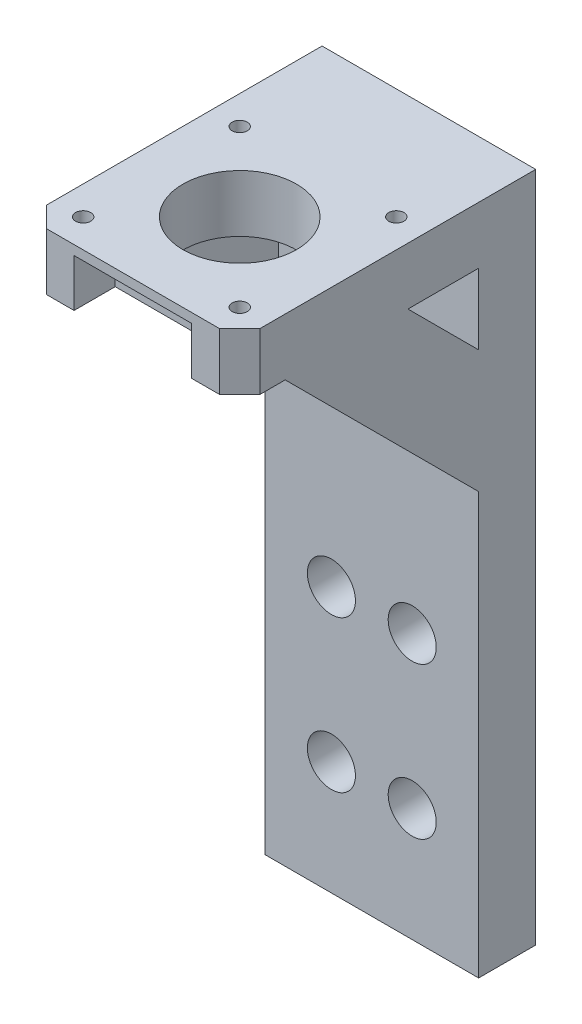
ISO-10303-21;
HEADER;
FILE_DESCRIPTION(('STEP AP214'),'2;1');
FILE_NAME('part.step','',(''),(''),'','','');
FILE_SCHEMA(('AUTOMOTIVE_DESIGN { 1 0 10303 214 1 1 1 1 }'));
ENDSEC;
DATA;
#1=APPLICATION_CONTEXT('core data for automotive mechanical design processes');
#2=APPLICATION_PROTOCOL_DEFINITION('international standard','automotive_design',2000,#1);
#3=PRODUCT_CONTEXT('',#1,'mechanical');
#4=PRODUCT('Part','Part','',(#3));
#5=PRODUCT_RELATED_PRODUCT_CATEGORY('part','',(#4));
#6=PRODUCT_DEFINITION_FORMATION('','',#4);
#7=PRODUCT_DEFINITION_CONTEXT('part definition',#1,'design');
#8=PRODUCT_DEFINITION('design','',#6,#7);
#9=PRODUCT_DEFINITION_SHAPE('','',#8);
#10=(LENGTH_UNIT() NAMED_UNIT(*) SI_UNIT(.MILLI.,.METRE.));
#11=(NAMED_UNIT(*) PLANE_ANGLE_UNIT() SI_UNIT($,.RADIAN.));
#12=(NAMED_UNIT(*) SI_UNIT($,.STERADIAN.) SOLID_ANGLE_UNIT());
#13=UNCERTAINTY_MEASURE_WITH_UNIT(LENGTH_MEASURE(1.E-05),#10,'distance_accuracy_value','');
#14=(GEOMETRIC_REPRESENTATION_CONTEXT(3) GLOBAL_UNCERTAINTY_ASSIGNED_CONTEXT((#13)) GLOBAL_UNIT_ASSIGNED_CONTEXT((#10,
#11,#12)) REPRESENTATION_CONTEXT('',''));
#15=CARTESIAN_POINT('',(0.,0.,0.));
#16=DIRECTION('',(0.,0.,1.));
#17=DIRECTION('',(1.,0.,0.));
#18=AXIS2_PLACEMENT_3D('',#15,#16,#17);
#19=CARTESIAN_POINT('',(-75.3143794388894,-38.2999999999999,-26.15));
#20=DIRECTION('',(0.,0.707106781186549,-0.707106781186546));
#21=DIRECTION('',(0.,0.707106781186546,0.707106781186549));
#22=AXIS2_PLACEMENT_3D('',#19,#20,#21);
#23=PLANE('',#22);
#24=DIRECTION('',(0.,-0.707106781186546,-0.707106781186549));
#25=VECTOR('',#24,1.);
#26=CARTESIAN_POINT('',(-21.15,-38.2999999999999,-26.15));
#27=LINE('',#26,#25);
#28=CARTESIAN_POINT('',(-21.15,0.,12.15));
#29=VERTEX_POINT('',#28);
#30=CARTESIAN_POINT('',(-21.15,-24.2114581737199,-12.06145817372));
#31=VERTEX_POINT('',#30);
#32=EDGE_CURVE('E335',#29,#31,#27,.T.);
#33=ORIENTED_EDGE('',*,*,#32,.T.);
#34=DIRECTION('',(-1.,0.,0.));
#35=VECTOR('',#34,1.);
#36=CARTESIAN_POINT('',(-3.23326728916457,-24.2114581737199,-12.06145817372));
#37=LINE('',#36,#35);
#38=CARTESIAN_POINT('',(-18.5,-24.2114581737199,-12.06145817372));
#39=VERTEX_POINT('',#38);
#40=EDGE_CURVE('E225',#39,#31,#37,.T.);
#41=ORIENTED_EDGE('',*,*,#40,.F.);
#42=DIRECTION('',(0.,0.707106781186546,0.707106781186549));
#43=VECTOR('',#42,1.);
#44=CARTESIAN_POINT('',(-18.5,-38.2999999999999,-26.15));
#45=LINE('',#44,#43);
#46=CARTESIAN_POINT('',(-18.5,0.,12.15));
#47=VERTEX_POINT('',#46);
#48=EDGE_CURVE('E217',#39,#47,#45,.T.);
#49=ORIENTED_EDGE('',*,*,#48,.T.);
#50=DIRECTION('',(1.,0.,0.));
#51=VECTOR('',#50,1.);
#52=CARTESIAN_POINT('',(-75.3143794388894,0.,12.15));
#53=LINE('',#52,#51);
#54=EDGE_CURVE('E360',#29,#47,#53,.T.);
#55=ORIENTED_EDGE('',*,*,#54,.F.);
#56=EDGE_LOOP('',(#33,#41,#49,#55));
#57=FACE_BOUND('',#56,.T.);
#58=ADVANCED_FACE('F38',(#57),#23,.F.);
#59=CARTESIAN_POINT('',(0.,0.,0.));
#60=DIRECTION('',(0.,1.,0.));
#61=DIRECTION('',(0.,0.,1.));
#62=AXIS2_PLACEMENT_3D('',#59,#60,#61);
#63=PLANE('',#62);
#64=CARTESIAN_POINT('',(-15.5,0.,15.5));
#65=DIRECTION('',(0.,1.,0.));
#66=DIRECTION('',(0.,0.,1.));
#67=AXIS2_PLACEMENT_3D('',#64,#65,#66);
#68=CIRCLE('',#67,1.5);
#69=CARTESIAN_POINT('',(-15.5,0.,17.));
#70=VERTEX_POINT('',#69);
#71=EDGE_CURVE('E410',#70,#70,#68,.T.);
#72=ORIENTED_EDGE('',*,*,#71,.T.);
#73=EDGE_LOOP('',(#72));
#74=FACE_BOUND('',#73,.T.);
#75=CARTESIAN_POINT('',(15.5,0.,15.5));
#76=DIRECTION('',(0.,1.,0.));
#77=DIRECTION('',(0.,0.,1.));
#78=AXIS2_PLACEMENT_3D('',#75,#76,#77);
#79=CIRCLE('',#78,1.5);
#80=CARTESIAN_POINT('',(15.5,0.,17.));
#81=VERTEX_POINT('',#80);
#82=EDGE_CURVE('E415',#81,#81,#79,.T.);
#83=ORIENTED_EDGE('',*,*,#82,.T.);
#84=EDGE_LOOP('',(#83));
#85=FACE_BOUND('',#84,.T.);
#86=CARTESIAN_POINT('',(15.5,0.,-15.5));
#87=DIRECTION('',(0.,1.,0.));
#88=DIRECTION('',(0.,0.,1.));
#89=AXIS2_PLACEMENT_3D('',#86,#87,#88);
#90=CIRCLE('',#89,1.5);
#91=CARTESIAN_POINT('',(15.5,0.,-14.));
#92=VERTEX_POINT('',#91);
#93=EDGE_CURVE('E423',#92,#92,#90,.T.);
#94=ORIENTED_EDGE('',*,*,#93,.T.);
#95=EDGE_LOOP('',(#94));
#96=FACE_BOUND('',#95,.T.);
#97=CARTESIAN_POINT('',(-15.5,0.,-15.5));
#98=DIRECTION('',(0.,1.,0.));
#99=DIRECTION('',(0.,0.,1.));
#100=AXIS2_PLACEMENT_3D('',#97,#98,#99);
#101=CIRCLE('',#100,1.5);
#102=CARTESIAN_POINT('',(-15.5,0.,-14.));
#103=VERTEX_POINT('',#102);
#104=EDGE_CURVE('E431',#103,#103,#101,.T.);
#105=ORIENTED_EDGE('',*,*,#104,.T.);
#106=EDGE_LOOP('',(#105));
#107=FACE_BOUND('',#106,.T.);
#108=CARTESIAN_POINT('',(0.,0.,0.));
#109=DIRECTION('',(0.,1.,0.));
#110=DIRECTION('',(0.,0.,1.));
#111=AXIS2_PLACEMENT_3D('',#108,#109,#110);
#112=CIRCLE('',#111,11.25);
#113=CARTESIAN_POINT('',(0.,0.,11.25));
#114=VERTEX_POINT('',#113);
#115=EDGE_CURVE('E439',#114,#114,#112,.T.);
#116=ORIENTED_EDGE('',*,*,#115,.T.);
#117=EDGE_LOOP('',(#116));
#118=FACE_BOUND('',#117,.T.);
#119=DIRECTION('',(1.,0.,0.));
#120=VECTOR('',#119,1.);
#121=CARTESIAN_POINT('',(-11.65,0.,13.));
#122=LINE('',#121,#120);
#123=CARTESIAN_POINT('',(-11.65,0.,13.));
#124=VERTEX_POINT('',#123);
#125=CARTESIAN_POINT('',(11.65,0.,13.));
#126=VERTEX_POINT('',#125);
#127=EDGE_CURVE('E247',#124,#126,#122,.T.);
#128=ORIENTED_EDGE('',*,*,#127,.F.);
#129=DIRECTION('',(0.,0.,-1.));
#130=VECTOR('',#129,1.);
#131=CARTESIAN_POINT('',(-11.65,0.,21.15));
#132=LINE('',#131,#130);
#133=CARTESIAN_POINT('',(-11.65,0.,21.15));
#134=VERTEX_POINT('',#133);
#135=EDGE_CURVE('E229',#134,#124,#132,.T.);
#136=ORIENTED_EDGE('',*,*,#135,.F.);
#137=DIRECTION('',(1.,0.,0.));
#138=VECTOR('',#137,1.);
#139=CARTESIAN_POINT('',(-17.15,0.,21.15));
#140=LINE('',#139,#138);
#141=CARTESIAN_POINT('',(-17.15,0.,21.15));
#142=VERTEX_POINT('',#141);
#143=EDGE_CURVE('E476',#142,#134,#140,.T.);
#144=ORIENTED_EDGE('',*,*,#143,.F.);
#145=DIRECTION('',(0.707106781186548,0.,0.707106781186548));
#146=VECTOR('',#145,1.);
#147=CARTESIAN_POINT('',(-17.15,0.,21.15));
#148=LINE('',#147,#146);
#149=CARTESIAN_POINT('',(-21.15,0.,17.15));
#150=VERTEX_POINT('',#149);
#151=EDGE_CURVE('E472',#150,#142,#148,.T.);
#152=ORIENTED_EDGE('',*,*,#151,.F.);
#153=DIRECTION('',(0.,0.,1.));
#154=VECTOR('',#153,1.);
#155=CARTESIAN_POINT('',(-21.15,0.,17.15));
#156=LINE('',#155,#154);
#157=EDGE_CURVE('E447',#29,#150,#156,.T.);
#158=ORIENTED_EDGE('',*,*,#157,.F.);
#159=ORIENTED_EDGE('',*,*,#54,.T.);
#160=DIRECTION('',(0.,0.,-1.));
#161=VECTOR('',#160,1.);
#162=CARTESIAN_POINT('',(-18.5,0.,12.15));
#163=LINE('',#162,#161);
#164=CARTESIAN_POINT('',(-18.5,0.,-12.15));
#165=VERTEX_POINT('',#164);
#166=EDGE_CURVE('E346',#47,#165,#163,.T.);
#167=ORIENTED_EDGE('',*,*,#166,.T.);
#168=DIRECTION('',(1.,0.,0.));
#169=VECTOR('',#168,1.);
#170=CARTESIAN_POINT('',(-75.3143794388894,0.,-12.15));
#171=LINE('',#170,#169);
#172=CARTESIAN_POINT('',(-21.15,0.,-12.15));
#173=VERTEX_POINT('',#172);
#174=EDGE_CURVE('E357',#173,#165,#171,.T.);
#175=ORIENTED_EDGE('',*,*,#174,.F.);
#176=CARTESIAN_POINT('',(-21.15,0.,-26.15));
#177=VERTEX_POINT('',#176);
#178=EDGE_CURVE('E468',#177,#173,#156,.T.);
#179=ORIENTED_EDGE('',*,*,#178,.F.);
#180=DIRECTION('',(-1.,0.,0.));
#181=VECTOR('',#180,1.);
#182=CARTESIAN_POINT('',(17.15,0.,-26.15));
#183=LINE('',#182,#181);
#184=CARTESIAN_POINT('',(21.15,0.,-26.15));
#185=VERTEX_POINT('',#184);
#186=EDGE_CURVE('E403',#185,#177,#183,.T.);
#187=ORIENTED_EDGE('',*,*,#186,.F.);
#188=DIRECTION('',(0.,0.,-1.));
#189=VECTOR('',#188,1.);
#190=CARTESIAN_POINT('',(21.15,0.,17.15));
#191=LINE('',#190,#189);
#192=CARTESIAN_POINT('',(21.15,0.,-12.15));
#193=VERTEX_POINT('',#192);
#194=EDGE_CURVE('E483',#193,#185,#191,.T.);
#195=ORIENTED_EDGE('',*,*,#194,.F.);
#196=DIRECTION('',(1.,0.,0.));
#197=VECTOR('',#196,1.);
#198=CARTESIAN_POINT('',(18.5,0.,-12.15));
#199=LINE('',#198,#197);
#200=CARTESIAN_POINT('',(18.5,0.,-12.15));
#201=VERTEX_POINT('',#200);
#202=EDGE_CURVE('E324',#201,#193,#199,.T.);
#203=ORIENTED_EDGE('',*,*,#202,.F.);
#204=DIRECTION('',(0.,0.,1.));
#205=VECTOR('',#204,1.);
#206=CARTESIAN_POINT('',(18.5,0.,12.15));
#207=LINE('',#206,#205);
#208=CARTESIAN_POINT('',(18.5,0.,12.15));
#209=VERTEX_POINT('',#208);
#210=EDGE_CURVE('E310',#201,#209,#207,.T.);
#211=ORIENTED_EDGE('',*,*,#210,.T.);
#212=DIRECTION('',(1.,0.,0.));
#213=VECTOR('',#212,1.);
#214=CARTESIAN_POINT('',(18.5,0.,12.15));
#215=LINE('',#214,#213);
#216=CARTESIAN_POINT('',(21.15,0.,12.15));
#217=VERTEX_POINT('',#216);
#218=EDGE_CURVE('E319',#209,#217,#215,.T.);
#219=ORIENTED_EDGE('',*,*,#218,.T.);
#220=CARTESIAN_POINT('',(21.15,0.,17.15));
#221=VERTEX_POINT('',#220);
#222=EDGE_CURVE('E455',#221,#217,#191,.T.);
#223=ORIENTED_EDGE('',*,*,#222,.F.);
#224=DIRECTION('',(0.707106781186548,0.,-0.707106781186548));
#225=VECTOR('',#224,1.);
#226=CARTESIAN_POINT('',(17.15,0.,21.15));
#227=LINE('',#226,#225);
#228=CARTESIAN_POINT('',(17.15,0.,21.15));
#229=VERTEX_POINT('',#228);
#230=EDGE_CURVE('E480',#229,#221,#227,.T.);
#231=ORIENTED_EDGE('',*,*,#230,.F.);
#232=CARTESIAN_POINT('',(11.65,0.,21.15));
#233=VERTEX_POINT('',#232);
#234=EDGE_CURVE('E475',#233,#229,#140,.T.);
#235=ORIENTED_EDGE('',*,*,#234,.F.);
#236=DIRECTION('',(0.,0.,1.));
#237=VECTOR('',#236,1.);
#238=CARTESIAN_POINT('',(11.65,0.,21.15));
#239=LINE('',#238,#237);
#240=EDGE_CURVE('E235',#126,#233,#239,.T.);
#241=ORIENTED_EDGE('',*,*,#240,.F.);
#242=EDGE_LOOP('',(#128,#136,#144,#152,#158,#159,#167,#175,#179,#187,#195,#203,#211,#219,#223,
#231,#235,#241));
#243=FACE_BOUND('',#242,.T.);
#244=ADVANCED_FACE('F508',(#74,#85,#96,#107,#118,#243),#63,.F.);
#245=CARTESIAN_POINT('',(0.,0.,-26.15));
#246=DIRECTION('',(0.,0.,-1.));
#247=DIRECTION('',(-1.,0.,0.));
#248=AXIS2_PLACEMENT_3D('',#245,#246,#247);
#249=PLANE('',#248);
#250=CARTESIAN_POINT('',(8.,-69.2,-26.15));
#251=DIRECTION('',(0.,0.,-1.));
#252=DIRECTION('',(-1.,0.,0.));
#253=AXIS2_PLACEMENT_3D('',#250,#251,#252);
#254=CIRCLE('',#253,4.76249999999999);
#255=CARTESIAN_POINT('',(3.2375,-69.2,-26.15));
#256=VERTEX_POINT('',#255);
#257=EDGE_CURVE('E293',#256,#256,#254,.T.);
#258=ORIENTED_EDGE('',*,*,#257,.T.);
#259=EDGE_LOOP('',(#258));
#260=FACE_BOUND('',#259,.T.);
#261=CARTESIAN_POINT('',(-8.,-99.2,-26.15));
#262=DIRECTION('',(0.,0.,-1.));
#263=DIRECTION('',(-1.,0.,0.));
#264=AXIS2_PLACEMENT_3D('',#261,#262,#263);
#265=CIRCLE('',#264,4.7625);
#266=CARTESIAN_POINT('',(-12.7625,-99.2,-26.15));
#267=VERTEX_POINT('',#266);
#268=EDGE_CURVE('E289',#267,#267,#265,.T.);
#269=ORIENTED_EDGE('',*,*,#268,.T.);
#270=EDGE_LOOP('',(#269));
#271=FACE_BOUND('',#270,.T.);
#272=CARTESIAN_POINT('',(8.,-99.2,-26.15));
#273=DIRECTION('',(0.,0.,-1.));
#274=DIRECTION('',(-1.,0.,0.));
#275=AXIS2_PLACEMENT_3D('',#272,#273,#274);
#276=CIRCLE('',#275,4.76249999999999);
#277=CARTESIAN_POINT('',(3.2375,-99.2,-26.15));
#278=VERTEX_POINT('',#277);
#279=EDGE_CURVE('E285',#278,#278,#276,.T.);
#280=ORIENTED_EDGE('',*,*,#279,.T.);
#281=EDGE_LOOP('',(#280));
#282=FACE_BOUND('',#281,.T.);
#283=CARTESIAN_POINT('',(-8.,-69.2,-26.15));
#284=DIRECTION('',(0.,0.,-1.));
#285=DIRECTION('',(-1.,0.,0.));
#286=AXIS2_PLACEMENT_3D('',#283,#284,#285);
#287=CIRCLE('',#286,4.7625);
#288=CARTESIAN_POINT('',(-12.7625,-69.2,-26.15));
#289=VERTEX_POINT('',#288);
#290=EDGE_CURVE('E281',#289,#289,#287,.T.);
#291=ORIENTED_EDGE('',*,*,#290,.T.);
#292=EDGE_LOOP('',(#291));
#293=FACE_BOUND('',#292,.T.);
#294=DIRECTION('',(0.,-1.,0.));
#295=VECTOR('',#294,1.);
#296=CARTESIAN_POINT('',(21.15,9.84885780179612,-26.15));
#297=LINE('',#296,#295);
#298=CARTESIAN_POINT('',(21.15,-38.2999999999999,-26.15));
#299=VERTEX_POINT('',#298);
#300=CARTESIAN_POINT('',(21.15,-121.7,-26.15));
#301=VERTEX_POINT('',#300);
#302=EDGE_CURVE('E339',#299,#301,#297,.T.);
#303=ORIENTED_EDGE('',*,*,#302,.F.);
#304=DIRECTION('',(1.,0.,0.));
#305=VECTOR('',#304,1.);
#306=CARTESIAN_POINT('',(18.5,-38.2999999999999,-26.15));
#307=LINE('',#306,#305);
#308=CARTESIAN_POINT('',(18.5,-38.2999999999999,-26.15));
#309=VERTEX_POINT('',#308);
#310=EDGE_CURVE('E314',#309,#299,#307,.T.);
#311=ORIENTED_EDGE('',*,*,#310,.F.);
#312=DIRECTION('',(0.,1.,0.));
#313=VECTOR('',#312,1.);
#314=CARTESIAN_POINT('',(18.5,-14.,-26.15));
#315=LINE('',#314,#313);
#316=CARTESIAN_POINT('',(18.5,-14.,-26.15));
#317=VERTEX_POINT('',#316);
#318=EDGE_CURVE('E302',#309,#317,#315,.T.);
#319=ORIENTED_EDGE('',*,*,#318,.T.);
#320=DIRECTION('',(1.,0.,0.));
#321=VECTOR('',#320,1.);
#322=CARTESIAN_POINT('',(18.5,-14.,-26.15));
#323=LINE('',#322,#321);
#324=CARTESIAN_POINT('',(21.15,-14.,-26.15));
#325=VERTEX_POINT('',#324);
#326=EDGE_CURVE('E328',#317,#325,#323,.T.);
#327=ORIENTED_EDGE('',*,*,#326,.T.);
#328=EDGE_CURVE('E376',#185,#325,#297,.T.);
#329=ORIENTED_EDGE('',*,*,#328,.F.);
#330=ORIENTED_EDGE('',*,*,#186,.T.);
#331=DIRECTION('',(0.,-1.,0.));
#332=VECTOR('',#331,1.);
#333=CARTESIAN_POINT('',(-21.15,9.84885780179612,-26.15));
#334=LINE('',#333,#332);
#335=CARTESIAN_POINT('',(-21.15,-14.,-26.15));
#336=VERTEX_POINT('',#335);
#337=EDGE_CURVE('E371',#177,#336,#334,.T.);
#338=ORIENTED_EDGE('',*,*,#337,.T.);
#339=DIRECTION('',(1.,0.,0.));
#340=VECTOR('',#339,1.);
#341=CARTESIAN_POINT('',(-75.3143794388894,-14.,-26.15));
#342=LINE('',#341,#340);
#343=CARTESIAN_POINT('',(-18.5,-14.,-26.15));
#344=VERTEX_POINT('',#343);
#345=EDGE_CURVE('E354',#336,#344,#342,.T.);
#346=ORIENTED_EDGE('',*,*,#345,.T.);
#347=DIRECTION('',(0.,-1.,0.));
#348=VECTOR('',#347,1.);
#349=CARTESIAN_POINT('',(-18.5,-14.,-26.15));
#350=LINE('',#349,#348);
#351=CARTESIAN_POINT('',(-18.5,-38.2999999999999,-26.15));
#352=VERTEX_POINT('',#351);
#353=EDGE_CURVE('E323',#344,#352,#350,.T.);
#354=ORIENTED_EDGE('',*,*,#353,.T.);
#355=DIRECTION('',(1.,0.,0.));
#356=VECTOR('',#355,1.);
#357=CARTESIAN_POINT('',(-75.3143794388894,-38.2999999999999,-26.15));
#358=LINE('',#357,#356);
#359=CARTESIAN_POINT('',(-21.15,-38.2999999999999,-26.15));
#360=VERTEX_POINT('',#359);
#361=EDGE_CURVE('E364',#360,#352,#358,.T.);
#362=ORIENTED_EDGE('',*,*,#361,.F.);
#363=CARTESIAN_POINT('',(-21.15,-121.7,-26.15));
#364=VERTEX_POINT('',#363);
#365=EDGE_CURVE('E375',#360,#364,#334,.T.);
#366=ORIENTED_EDGE('',*,*,#365,.T.);
#367=DIRECTION('',(-1.,0.,0.));
#368=VECTOR('',#367,1.);
#369=CARTESIAN_POINT('',(17.15,-121.7,-26.15));
#370=LINE('',#369,#368);
#371=EDGE_CURVE('E394',#301,#364,#370,.T.);
#372=ORIENTED_EDGE('',*,*,#371,.F.);
#373=EDGE_LOOP('',(#303,#311,#319,#327,#329,#330,#338,#346,#354,#362,#366,#372));
#374=FACE_BOUND('',#373,.T.);
#375=ADVANCED_FACE('F554',(#260,#271,#282,#293,#374),#249,.F.);
#376=CARTESIAN_POINT('',(0.,11.3,0.));
#377=DIRECTION('',(0.,1.,0.));
#378=DIRECTION('',(0.,0.,1.));
#379=AXIS2_PLACEMENT_3D('',#376,#377,#378);
#380=PLANE('',#379);
#381=DIRECTION('',(1.,0.,0.));
#382=VECTOR('',#381,1.);
#383=CARTESIAN_POINT('',(17.15,11.3,-37.45));
#384=LINE('',#383,#382);
#385=CARTESIAN_POINT('',(-21.15,11.3,-37.45));
#386=VERTEX_POINT('',#385);
#387=CARTESIAN_POINT('',(21.15,11.3,-37.45));
#388=VERTEX_POINT('',#387);
#389=EDGE_CURVE('E399',#386,#388,#384,.T.);
#390=ORIENTED_EDGE('',*,*,#389,.F.);
#391=DIRECTION('',(0.,0.,1.));
#392=VECTOR('',#391,1.);
#393=CARTESIAN_POINT('',(-21.15,11.3,17.15));
#394=LINE('',#393,#392);
#395=CARTESIAN_POINT('',(-21.15,11.3,17.15));
#396=VERTEX_POINT('',#395);
#397=EDGE_CURVE('E451',#386,#396,#394,.T.);
#398=ORIENTED_EDGE('',*,*,#397,.T.);
#399=DIRECTION('',(0.707106781186548,0.,0.707106781186548));
#400=VECTOR('',#399,1.);
#401=CARTESIAN_POINT('',(-17.15,11.3,21.15));
#402=LINE('',#401,#400);
#403=CARTESIAN_POINT('',(-17.15,11.3,21.15));
#404=VERTEX_POINT('',#403);
#405=EDGE_CURVE('E454',#396,#404,#402,.T.);
#406=ORIENTED_EDGE('',*,*,#405,.T.);
#407=DIRECTION('',(1.,0.,0.));
#408=VECTOR('',#407,1.);
#409=CARTESIAN_POINT('',(-17.15,11.3,21.15));
#410=LINE('',#409,#408);
#411=CARTESIAN_POINT('',(17.15,11.3,21.15));
#412=VERTEX_POINT('',#411);
#413=EDGE_CURVE('E458',#404,#412,#410,.T.);
#414=ORIENTED_EDGE('',*,*,#413,.T.);
#415=DIRECTION('',(0.707106781186548,0.,-0.707106781186548));
#416=VECTOR('',#415,1.);
#417=CARTESIAN_POINT('',(17.15,11.3,21.15));
#418=LINE('',#417,#416);
#419=CARTESIAN_POINT('',(21.15,11.3,17.15));
#420=VERTEX_POINT('',#419);
#421=EDGE_CURVE('E461',#412,#420,#418,.T.);
#422=ORIENTED_EDGE('',*,*,#421,.T.);
#423=DIRECTION('',(0.,0.,-1.));
#424=VECTOR('',#423,1.);
#425=CARTESIAN_POINT('',(21.15,11.3,17.15));
#426=LINE('',#425,#424);
#427=EDGE_CURVE('E464',#420,#388,#426,.T.);
#428=ORIENTED_EDGE('',*,*,#427,.T.);
#429=EDGE_LOOP('',(#390,#398,#406,#414,#422,#428));
#430=FACE_BOUND('',#429,.T.);
#431=CARTESIAN_POINT('',(15.5,11.3,15.5));
#432=DIRECTION('',(0.,1.,0.));
#433=DIRECTION('',(0.,0.,1.));
#434=AXIS2_PLACEMENT_3D('',#431,#432,#433);
#435=CIRCLE('',#434,1.5);
#436=CARTESIAN_POINT('',(15.5,11.3,17.));
#437=VERTEX_POINT('',#436);
#438=EDGE_CURVE('E419',#437,#437,#435,.T.);
#439=ORIENTED_EDGE('',*,*,#438,.F.);
#440=EDGE_LOOP('',(#439));
#441=FACE_BOUND('',#440,.T.);
#442=CARTESIAN_POINT('',(-15.5,11.3,-15.5));
#443=DIRECTION('',(0.,1.,0.));
#444=DIRECTION('',(0.,0.,1.));
#445=AXIS2_PLACEMENT_3D('',#442,#443,#444);
#446=CIRCLE('',#445,1.5);
#447=CARTESIAN_POINT('',(-15.5,11.3,-14.));
#448=VERTEX_POINT('',#447);
#449=EDGE_CURVE('E435',#448,#448,#446,.T.);
#450=ORIENTED_EDGE('',*,*,#449,.F.);
#451=EDGE_LOOP('',(#450));
#452=FACE_BOUND('',#451,.T.);
#453=CARTESIAN_POINT('',(0.,11.3,0.));
#454=DIRECTION('',(0.,1.,0.));
#455=DIRECTION('',(0.,0.,1.));
#456=AXIS2_PLACEMENT_3D('',#453,#454,#455);
#457=CIRCLE('',#456,11.25);
#458=CARTESIAN_POINT('',(0.,11.3,11.25));
#459=VERTEX_POINT('',#458);
#460=EDGE_CURVE('E443',#459,#459,#457,.T.);
#461=ORIENTED_EDGE('',*,*,#460,.F.);
#462=EDGE_LOOP('',(#461));
#463=FACE_BOUND('',#462,.T.);
#464=CARTESIAN_POINT('',(15.5,11.3,-15.5));
#465=DIRECTION('',(0.,1.,0.));
#466=DIRECTION('',(0.,0.,1.));
#467=AXIS2_PLACEMENT_3D('',#464,#465,#466);
#468=CIRCLE('',#467,1.5);
#469=CARTESIAN_POINT('',(15.5,11.3,-14.));
#470=VERTEX_POINT('',#469);
#471=EDGE_CURVE('E427',#470,#470,#468,.T.);
#472=ORIENTED_EDGE('',*,*,#471,.F.);
#473=EDGE_LOOP('',(#472));
#474=FACE_BOUND('',#473,.T.);
#475=CARTESIAN_POINT('',(-15.5,11.3,15.5));
#476=DIRECTION('',(0.,1.,0.));
#477=DIRECTION('',(0.,0.,1.));
#478=AXIS2_PLACEMENT_3D('',#475,#476,#477);
#479=CIRCLE('',#478,1.5);
#480=CARTESIAN_POINT('',(-15.5,11.3,17.));
#481=VERTEX_POINT('',#480);
#482=EDGE_CURVE('E411',#481,#481,#479,.T.);
#483=ORIENTED_EDGE('',*,*,#482,.F.);
#484=EDGE_LOOP('',(#483));
#485=FACE_BOUND('',#484,.T.);
#486=ADVANCED_FACE('F540',(#430,#441,#452,#463,#474,#485),#380,.T.);
#487=CARTESIAN_POINT('',(-21.15,11.3,17.15));
#488=DIRECTION('',(1.,0.,0.));
#489=DIRECTION('',(0.,0.,-1.));
#490=AXIS2_PLACEMENT_3D('',#487,#488,#489);
#491=PLANE('',#490);
#492=DIRECTION('',(0.,-1.,0.));
#493=VECTOR('',#492,1.);
#494=CARTESIAN_POINT('',(-21.15,-35.0066684001141,-22.8566684001142));
#495=LINE('',#494,#493);
#496=CARTESIAN_POINT('',(-21.15,-24.2114581737199,-22.8566684001142));
#497=VERTEX_POINT('',#496);
#498=CARTESIAN_POINT('',(-21.15,-35.0066684001141,-22.8566684001142));
#499=VERTEX_POINT('',#498);
#500=EDGE_CURVE('E54',#497,#499,#495,.T.);
#501=ORIENTED_EDGE('',*,*,#500,.F.);
#502=DIRECTION('',(0.,0.,-1.));
#503=VECTOR('',#502,1.);
#504=CARTESIAN_POINT('',(-21.15,-24.2114581737199,-22.8566684001142));
#505=LINE('',#504,#503);
#506=EDGE_CURVE('E211',#31,#497,#505,.T.);
#507=ORIENTED_EDGE('',*,*,#506,.F.);
#508=ORIENTED_EDGE('',*,*,#32,.F.);
#509=ORIENTED_EDGE('',*,*,#157,.T.);
#510=DIRECTION('',(0.,-1.,0.));
#511=VECTOR('',#510,1.);
#512=CARTESIAN_POINT('',(-21.15,11.3,17.15));
#513=LINE('',#512,#511);
#514=EDGE_CURVE('E11',#396,#150,#513,.T.);
#515=ORIENTED_EDGE('',*,*,#514,.F.);
#516=ORIENTED_EDGE('',*,*,#397,.F.);
#517=DIRECTION('',(0.,1.,0.));
#518=VECTOR('',#517,1.);
#519=CARTESIAN_POINT('',(-21.15,-142.390335908341,-37.45));
#520=LINE('',#519,#518);
#521=CARTESIAN_POINT('',(-21.15,-121.7,-37.45));
#522=VERTEX_POINT('',#521);
#523=EDGE_CURVE('E374',#522,#386,#520,.T.);
#524=ORIENTED_EDGE('',*,*,#523,.F.);
#525=DIRECTION('',(0.,0.,-1.));
#526=VECTOR('',#525,1.);
#527=CARTESIAN_POINT('',(-21.15,-121.7,-17.15));
#528=LINE('',#527,#526);
#529=EDGE_CURVE('E383',#364,#522,#528,.T.);
#530=ORIENTED_EDGE('',*,*,#529,.F.);
#531=ORIENTED_EDGE('',*,*,#365,.F.);
#532=EDGE_CURVE('E340',#499,#360,#27,.T.);
#533=ORIENTED_EDGE('',*,*,#532,.F.);
#534=EDGE_LOOP('',(#501,#507,#508,#509,#515,#516,#524,#530,#531,#533));
#535=FACE_BOUND('',#534,.T.);
#536=ORIENTED_EDGE('',*,*,#337,.F.);
#537=ORIENTED_EDGE('',*,*,#178,.T.);
#538=DIRECTION('',(0.,0.707106781186546,0.707106781186549));
#539=VECTOR('',#538,1.);
#540=CARTESIAN_POINT('',(-21.15,0.,-12.15));
#541=LINE('',#540,#539);
#542=EDGE_CURVE('E368',#336,#173,#541,.T.);
#543=ORIENTED_EDGE('',*,*,#542,.F.);
#544=EDGE_LOOP('',(#536,#537,#543));
#545=FACE_BOUND('',#544,.T.);
#546=ADVANCED_FACE('F40',(#535,#545),#491,.F.);
#547=CARTESIAN_POINT('',(-17.15,11.3,21.15));
#548=DIRECTION('',(0.707106781186548,0.,-0.707106781186548));
#549=DIRECTION('',(-0.707106781186548,0.,-0.707106781186548));
#550=AXIS2_PLACEMENT_3D('',#547,#548,#549);
#551=PLANE('',#550);
#552=ORIENTED_EDGE('',*,*,#151,.T.);
#553=DIRECTION('',(0.,-1.,0.));
#554=VECTOR('',#553,1.);
#555=CARTESIAN_POINT('',(-17.15,11.3,21.15));
#556=LINE('',#555,#554);
#557=EDGE_CURVE('E47',#404,#142,#556,.T.);
#558=ORIENTED_EDGE('',*,*,#557,.F.);
#559=ORIENTED_EDGE('',*,*,#405,.F.);
#560=ORIENTED_EDGE('',*,*,#514,.T.);
#561=EDGE_LOOP('',(#552,#558,#559,#560));
#562=FACE_BOUND('',#561,.T.);
#563=ADVANCED_FACE('F537',(#562),#551,.F.);
#564=CARTESIAN_POINT('',(-17.15,11.3,21.15));
#565=DIRECTION('',(0.,0.,-1.));
#566=DIRECTION('',(-1.,0.,0.));
#567=AXIS2_PLACEMENT_3D('',#564,#565,#566);
#568=PLANE('',#567);
#569=ORIENTED_EDGE('',*,*,#143,.T.);
#570=DIRECTION('',(0.,-1.,0.));
#571=VECTOR('',#570,1.);
#572=CARTESIAN_POINT('',(-11.65,9.43,21.15));
#573=LINE('',#572,#571);
#574=CARTESIAN_POINT('',(-11.65,9.43,21.15));
#575=VERTEX_POINT('',#574);
#576=EDGE_CURVE('E253',#575,#134,#573,.T.);
#577=ORIENTED_EDGE('',*,*,#576,.F.);
#578=DIRECTION('',(-1.,0.,0.));
#579=VECTOR('',#578,1.);
#580=CARTESIAN_POINT('',(-11.65,9.43,21.15));
#581=LINE('',#580,#579);
#582=CARTESIAN_POINT('',(11.65,9.43,21.15));
#583=VERTEX_POINT('',#582);
#584=EDGE_CURVE('E240',#583,#575,#581,.T.);
#585=ORIENTED_EDGE('',*,*,#584,.F.);
#586=DIRECTION('',(0.,-1.,0.));
#587=VECTOR('',#586,1.);
#588=CARTESIAN_POINT('',(11.65,9.43,21.15));
#589=LINE('',#588,#587);
#590=EDGE_CURVE('E257',#583,#233,#589,.T.);
#591=ORIENTED_EDGE('',*,*,#590,.T.);
#592=ORIENTED_EDGE('',*,*,#234,.T.);
#593=DIRECTION('',(0.,-1.,0.));
#594=VECTOR('',#593,1.);
#595=CARTESIAN_POINT('',(17.15,11.3,21.15));
#596=LINE('',#595,#594);
#597=EDGE_CURVE('E490',#412,#229,#596,.T.);
#598=ORIENTED_EDGE('',*,*,#597,.F.);
#599=ORIENTED_EDGE('',*,*,#413,.F.);
#600=ORIENTED_EDGE('',*,*,#557,.T.);
#601=EDGE_LOOP('',(#569,#577,#585,#591,#592,#598,#599,#600));
#602=FACE_BOUND('',#601,.T.);
#603=ADVANCED_FACE('F499',(#602),#568,.F.);
#604=CARTESIAN_POINT('',(17.15,11.3,21.15));
#605=DIRECTION('',(-0.707106781186548,0.,-0.707106781186548));
#606=DIRECTION('',(-0.707106781186548,0.,0.707106781186548));
#607=AXIS2_PLACEMENT_3D('',#604,#605,#606);
#608=PLANE('',#607);
#609=ORIENTED_EDGE('',*,*,#230,.T.);
#610=DIRECTION('',(0.,-1.,0.));
#611=VECTOR('',#610,1.);
#612=CARTESIAN_POINT('',(21.15,11.3,17.15));
#613=LINE('',#612,#611);
#614=EDGE_CURVE('E467',#420,#221,#613,.T.);
#615=ORIENTED_EDGE('',*,*,#614,.F.);
#616=ORIENTED_EDGE('',*,*,#421,.F.);
#617=ORIENTED_EDGE('',*,*,#597,.T.);
#618=EDGE_LOOP('',(#609,#615,#616,#617));
#619=FACE_BOUND('',#618,.T.);
#620=ADVANCED_FACE('F693',(#619),#608,.F.);
#621=CARTESIAN_POINT('',(21.15,11.3,17.15));
#622=DIRECTION('',(-1.,0.,0.));
#623=DIRECTION('',(0.,0.,1.));
#624=AXIS2_PLACEMENT_3D('',#621,#622,#623);
#625=PLANE('',#624);
#626=ORIENTED_EDGE('',*,*,#222,.T.);
#627=DIRECTION('',(0.,-0.707106781186546,-0.707106781186548));
#628=VECTOR('',#627,1.);
#629=CARTESIAN_POINT('',(21.15,-38.2999999999999,-26.15));
#630=LINE('',#629,#628);
#631=EDGE_CURVE('E297',#217,#299,#630,.T.);
#632=ORIENTED_EDGE('',*,*,#631,.T.);
#633=ORIENTED_EDGE('',*,*,#302,.T.);
#634=DIRECTION('',(0.,0.,1.));
#635=VECTOR('',#634,1.);
#636=CARTESIAN_POINT('',(21.15,-121.7,-17.15));
#637=LINE('',#636,#635);
#638=CARTESIAN_POINT('',(21.15,-121.7,-37.45));
#639=VERTEX_POINT('',#638);
#640=EDGE_CURVE('E390',#639,#301,#637,.T.);
#641=ORIENTED_EDGE('',*,*,#640,.F.);
#642=DIRECTION('',(0.,1.,0.));
#643=VECTOR('',#642,1.);
#644=CARTESIAN_POINT('',(21.15,-142.390335908341,-37.45));
#645=LINE('',#644,#643);
#646=EDGE_CURVE('E386',#639,#388,#645,.T.);
#647=ORIENTED_EDGE('',*,*,#646,.T.);
#648=ORIENTED_EDGE('',*,*,#427,.F.);
#649=ORIENTED_EDGE('',*,*,#614,.T.);
#650=EDGE_LOOP('',(#626,#632,#633,#641,#647,#648,#649));
#651=FACE_BOUND('',#650,.T.);
#652=DIRECTION('',(0.,0.707106781186546,0.707106781186548));
#653=VECTOR('',#652,1.);
#654=CARTESIAN_POINT('',(21.15,0.,-12.15));
#655=LINE('',#654,#653);
#656=EDGE_CURVE('E303',#325,#193,#655,.T.);
#657=ORIENTED_EDGE('',*,*,#656,.T.);
#658=ORIENTED_EDGE('',*,*,#194,.T.);
#659=ORIENTED_EDGE('',*,*,#328,.T.);
#660=EDGE_LOOP('',(#657,#658,#659));
#661=FACE_BOUND('',#660,.T.);
#662=ADVANCED_FACE('F689',(#651,#661),#625,.F.);
#663=CARTESIAN_POINT('',(0.,11.3,0.));
#664=DIRECTION('',(0.,-1.,0.));
#665=DIRECTION('',(0.,0.,-1.));
#666=AXIS2_PLACEMENT_3D('',#663,#664,#665);
#667=CYLINDRICAL_SURFACE('',#666,11.25);
#668=ORIENTED_EDGE('',*,*,#460,.T.);
#669=EDGE_LOOP('',(#668));
#670=FACE_BOUND('',#669,.T.);
#671=ORIENTED_EDGE('',*,*,#115,.F.);
#672=EDGE_LOOP('',(#671));
#673=FACE_BOUND('',#672,.T.);
#674=ADVANCED_FACE('F692',(#670,#673),#667,.F.);
#675=CARTESIAN_POINT('',(-15.5,11.3,-15.5));
#676=DIRECTION('',(0.,-1.,0.));
#677=DIRECTION('',(0.,0.,-1.));
#678=AXIS2_PLACEMENT_3D('',#675,#676,#677);
#679=CYLINDRICAL_SURFACE('',#678,1.5);
#680=ORIENTED_EDGE('',*,*,#449,.T.);
#681=EDGE_LOOP('',(#680));
#682=FACE_BOUND('',#681,.T.);
#683=ORIENTED_EDGE('',*,*,#104,.F.);
#684=EDGE_LOOP('',(#683));
#685=FACE_BOUND('',#684,.T.);
#686=ADVANCED_FACE('F755',(#682,#685),#679,.F.);
#687=CARTESIAN_POINT('',(15.5,11.3,-15.5));
#688=DIRECTION('',(0.,-1.,0.));
#689=DIRECTION('',(0.,0.,-1.));
#690=AXIS2_PLACEMENT_3D('',#687,#688,#689);
#691=CYLINDRICAL_SURFACE('',#690,1.5);
#692=ORIENTED_EDGE('',*,*,#471,.T.);
#693=EDGE_LOOP('',(#692));
#694=FACE_BOUND('',#693,.T.);
#695=ORIENTED_EDGE('',*,*,#93,.F.);
#696=EDGE_LOOP('',(#695));
#697=FACE_BOUND('',#696,.T.);
#698=ADVANCED_FACE('F745',(#694,#697),#691,.F.);
#699=CARTESIAN_POINT('',(15.5,11.3,15.5));
#700=DIRECTION('',(0.,-1.,0.));
#701=DIRECTION('',(0.,0.,-1.));
#702=AXIS2_PLACEMENT_3D('',#699,#700,#701);
#703=CYLINDRICAL_SURFACE('',#702,1.5);
#704=ORIENTED_EDGE('',*,*,#438,.T.);
#705=EDGE_LOOP('',(#704));
#706=FACE_BOUND('',#705,.T.);
#707=ORIENTED_EDGE('',*,*,#82,.F.);
#708=EDGE_LOOP('',(#707));
#709=FACE_BOUND('',#708,.T.);
#710=ADVANCED_FACE('F734',(#706,#709),#703,.F.);
#711=CARTESIAN_POINT('',(-15.5,11.3,15.5));
#712=DIRECTION('',(0.,-1.,0.));
#713=DIRECTION('',(0.,0.,-1.));
#714=AXIS2_PLACEMENT_3D('',#711,#712,#713);
#715=CYLINDRICAL_SURFACE('',#714,1.5);
#716=ORIENTED_EDGE('',*,*,#482,.T.);
#717=EDGE_LOOP('',(#716));
#718=FACE_BOUND('',#717,.T.);
#719=ORIENTED_EDGE('',*,*,#71,.F.);
#720=EDGE_LOOP('',(#719));
#721=FACE_BOUND('',#720,.T.);
#722=ADVANCED_FACE('F713',(#718,#721),#715,.F.);
#723=CARTESIAN_POINT('',(17.15,-121.7,-37.45));
#724=DIRECTION('',(0.,1.,0.));
#725=DIRECTION('',(0.,0.,1.));
#726=AXIS2_PLACEMENT_3D('',#723,#724,#725);
#727=PLANE('',#726);
#728=ORIENTED_EDGE('',*,*,#371,.T.);
#729=ORIENTED_EDGE('',*,*,#529,.T.);
#730=DIRECTION('',(-1.,0.,0.));
#731=VECTOR('',#730,1.);
#732=CARTESIAN_POINT('',(17.15,-121.7,-37.45));
#733=LINE('',#732,#731);
#734=EDGE_CURVE('E395',#639,#522,#733,.T.);
#735=ORIENTED_EDGE('',*,*,#734,.F.);
#736=ORIENTED_EDGE('',*,*,#640,.T.);
#737=EDGE_LOOP('',(#728,#729,#735,#736));
#738=FACE_BOUND('',#737,.T.);
#739=ADVANCED_FACE('F550',(#738),#727,.F.);
#740=CARTESIAN_POINT('',(0.,0.,-37.45));
#741=DIRECTION('',(0.,0.,-1.));
#742=DIRECTION('',(-1.,0.,0.));
#743=AXIS2_PLACEMENT_3D('',#740,#741,#742);
#744=PLANE('',#743);
#745=CARTESIAN_POINT('',(8.,-69.2,-37.45));
#746=DIRECTION('',(0.,0.,-1.));
#747=DIRECTION('',(-1.,0.,0.));
#748=AXIS2_PLACEMENT_3D('',#745,#746,#747);
#749=CIRCLE('',#748,4.76249999999999);
#750=CARTESIAN_POINT('',(3.2375,-69.2,-37.45));
#751=VERTEX_POINT('',#750);
#752=EDGE_CURVE('E270',#751,#751,#749,.T.);
#753=ORIENTED_EDGE('',*,*,#752,.F.);
#754=EDGE_LOOP('',(#753));
#755=FACE_BOUND('',#754,.T.);
#756=CARTESIAN_POINT('',(-8.,-99.2,-37.45));
#757=DIRECTION('',(0.,0.,-1.));
#758=DIRECTION('',(-1.,0.,0.));
#759=AXIS2_PLACEMENT_3D('',#756,#757,#758);
#760=CIRCLE('',#759,4.7625);
#761=CARTESIAN_POINT('',(-12.7625,-99.2,-37.45));
#762=VERTEX_POINT('',#761);
#763=EDGE_CURVE('E269',#762,#762,#760,.T.);
#764=ORIENTED_EDGE('',*,*,#763,.F.);
#765=EDGE_LOOP('',(#764));
#766=FACE_BOUND('',#765,.T.);
#767=CARTESIAN_POINT('',(8.,-99.2,-37.45));
#768=DIRECTION('',(0.,0.,-1.));
#769=DIRECTION('',(-1.,0.,0.));
#770=AXIS2_PLACEMENT_3D('',#767,#768,#769);
#771=CIRCLE('',#770,4.76249999999999);
#772=CARTESIAN_POINT('',(3.2375,-99.2,-37.45));
#773=VERTEX_POINT('',#772);
#774=EDGE_CURVE('E256',#773,#773,#771,.T.);
#775=ORIENTED_EDGE('',*,*,#774,.F.);
#776=EDGE_LOOP('',(#775));
#777=FACE_BOUND('',#776,.T.);
#778=CARTESIAN_POINT('',(-8.,-69.2,-37.45));
#779=DIRECTION('',(0.,0.,-1.));
#780=DIRECTION('',(-1.,0.,0.));
#781=AXIS2_PLACEMENT_3D('',#778,#779,#780);
#782=CIRCLE('',#781,4.7625);
#783=CARTESIAN_POINT('',(-12.7625,-69.2,-37.45));
#784=VERTEX_POINT('',#783);
#785=EDGE_CURVE('E274',#784,#784,#782,.T.);
#786=ORIENTED_EDGE('',*,*,#785,.F.);
#787=EDGE_LOOP('',(#786));
#788=FACE_BOUND('',#787,.T.);
#789=ORIENTED_EDGE('',*,*,#389,.T.);
#790=ORIENTED_EDGE('',*,*,#646,.F.);
#791=ORIENTED_EDGE('',*,*,#734,.T.);
#792=ORIENTED_EDGE('',*,*,#523,.T.);
#793=EDGE_LOOP('',(#789,#790,#791,#792));
#794=FACE_BOUND('',#793,.T.);
#795=ADVANCED_FACE('F546',(#755,#766,#777,#788,#794),#744,.T.);
#796=CARTESIAN_POINT('',(-18.5,0.,0.));
#797=DIRECTION('',(1.,0.,0.));
#798=DIRECTION('',(0.,0.,-1.));
#799=AXIS2_PLACEMENT_3D('',#796,#797,#798);
#800=PLANE('',#799);
#801=DIRECTION('',(0.,0.,-1.));
#802=VECTOR('',#801,1.);
#803=CARTESIAN_POINT('',(-18.5,-24.2114581737199,-22.8566684001142));
#804=LINE('',#803,#802);
#805=CARTESIAN_POINT('',(-18.5,-24.2114581737199,-22.8566684001142));
#806=VERTEX_POINT('',#805);
#807=EDGE_CURVE('E208',#39,#806,#804,.T.);
#808=ORIENTED_EDGE('',*,*,#807,.T.);
#809=DIRECTION('',(0.,-1.,0.));
#810=VECTOR('',#809,1.);
#811=CARTESIAN_POINT('',(-18.5,-35.0066684001141,-22.8566684001142));
#812=LINE('',#811,#810);
#813=CARTESIAN_POINT('',(-18.5,-35.0066684001141,-22.8566684001142));
#814=VERTEX_POINT('',#813);
#815=EDGE_CURVE('E194',#806,#814,#812,.T.);
#816=ORIENTED_EDGE('',*,*,#815,.T.);
#817=EDGE_CURVE('E343',#352,#814,#45,.T.);
#818=ORIENTED_EDGE('',*,*,#817,.F.);
#819=ORIENTED_EDGE('',*,*,#353,.F.);
#820=DIRECTION('',(0.,-0.707106781186546,-0.707106781186549));
#821=VECTOR('',#820,1.);
#822=CARTESIAN_POINT('',(-18.5,0.,-12.15));
#823=LINE('',#822,#821);
#824=EDGE_CURVE('E350',#165,#344,#823,.T.);
#825=ORIENTED_EDGE('',*,*,#824,.F.);
#826=ORIENTED_EDGE('',*,*,#166,.F.);
#827=ORIENTED_EDGE('',*,*,#48,.F.);
#828=EDGE_LOOP('',(#808,#816,#818,#819,#825,#826,#827));
#829=FACE_BOUND('',#828,.T.);
#830=ADVANCED_FACE('F215',(#829),#800,.T.);
#831=CARTESIAN_POINT('',(-75.3143794388894,0.,-12.15));
#832=DIRECTION('',(0.,-0.707106781186549,0.707106781186546));
#833=DIRECTION('',(0.,-0.707106781186546,-0.707106781186549));
#834=AXIS2_PLACEMENT_3D('',#831,#832,#833);
#835=PLANE('',#834);
#836=ORIENTED_EDGE('',*,*,#345,.F.);
#837=ORIENTED_EDGE('',*,*,#542,.T.);
#838=ORIENTED_EDGE('',*,*,#174,.T.);
#839=ORIENTED_EDGE('',*,*,#824,.T.);
#840=EDGE_LOOP('',(#836,#837,#838,#839));
#841=FACE_BOUND('',#840,.T.);
#842=ADVANCED_FACE('F564',(#841),#835,.F.);
#843=ORIENTED_EDGE('',*,*,#817,.T.);
#844=DIRECTION('',(-1.,0.,0.));
#845=VECTOR('',#844,1.);
#846=CARTESIAN_POINT('',(-3.23326728916457,-35.0066684001141,-22.8566684001142));
#847=LINE('',#846,#845);
#848=EDGE_CURVE('E199',#814,#499,#847,.T.);
#849=ORIENTED_EDGE('',*,*,#848,.T.);
#850=ORIENTED_EDGE('',*,*,#532,.T.);
#851=ORIENTED_EDGE('',*,*,#361,.T.);
#852=EDGE_LOOP('',(#843,#849,#850,#851));
#853=FACE_BOUND('',#852,.T.);
#854=ADVANCED_FACE('F559',(#853),#23,.F.);
#855=CARTESIAN_POINT('',(18.5,-38.2999999999999,-26.15));
#856=DIRECTION('',(0.,-0.707106781186549,0.707106781186546));
#857=DIRECTION('',(0.,-0.707106781186546,-0.707106781186549));
#858=AXIS2_PLACEMENT_3D('',#855,#856,#857);
#859=PLANE('',#858);
#860=ORIENTED_EDGE('',*,*,#631,.F.);
#861=ORIENTED_EDGE('',*,*,#218,.F.);
#862=DIRECTION('',(0.,-0.707106781186546,-0.707106781186548));
#863=VECTOR('',#862,1.);
#864=CARTESIAN_POINT('',(18.5,-38.2999999999999,-26.15));
#865=LINE('',#864,#863);
#866=EDGE_CURVE('E298',#209,#309,#865,.T.);
#867=ORIENTED_EDGE('',*,*,#866,.T.);
#868=ORIENTED_EDGE('',*,*,#310,.T.);
#869=EDGE_LOOP('',(#860,#861,#867,#868));
#870=FACE_BOUND('',#869,.T.);
#871=ADVANCED_FACE('F582',(#870),#859,.T.);
#872=CARTESIAN_POINT('',(18.5,0.,-12.15));
#873=DIRECTION('',(0.,0.707106781186548,-0.707106781186546));
#874=DIRECTION('',(0.,0.707106781186547,0.707106781186549));
#875=AXIS2_PLACEMENT_3D('',#872,#873,#874);
#876=PLANE('',#875);
#877=ORIENTED_EDGE('',*,*,#656,.F.);
#878=ORIENTED_EDGE('',*,*,#326,.F.);
#879=DIRECTION('',(0.,0.707106781186546,0.707106781186548));
#880=VECTOR('',#879,1.);
#881=CARTESIAN_POINT('',(18.5,0.,-12.15));
#882=LINE('',#881,#880);
#883=EDGE_CURVE('E307',#317,#201,#882,.T.);
#884=ORIENTED_EDGE('',*,*,#883,.T.);
#885=ORIENTED_EDGE('',*,*,#202,.T.);
#886=EDGE_LOOP('',(#877,#878,#884,#885));
#887=FACE_BOUND('',#886,.T.);
#888=ADVANCED_FACE('F587',(#887),#876,.T.);
#889=CARTESIAN_POINT('',(18.5,0.,0.));
#890=DIRECTION('',(-1.,0.,0.));
#891=DIRECTION('',(0.,-1.,0.));
#892=AXIS2_PLACEMENT_3D('',#889,#890,#891);
#893=PLANE('',#892);
#894=ORIENTED_EDGE('',*,*,#866,.F.);
#895=ORIENTED_EDGE('',*,*,#210,.F.);
#896=ORIENTED_EDGE('',*,*,#883,.F.);
#897=ORIENTED_EDGE('',*,*,#318,.F.);
#898=EDGE_LOOP('',(#894,#895,#896,#897));
#899=FACE_BOUND('',#898,.T.);
#900=ADVANCED_FACE('F597',(#899),#893,.T.);
#901=CARTESIAN_POINT('',(-8.,-69.2,21.15));
#902=DIRECTION('',(0.,0.,-1.));
#903=DIRECTION('',(-1.,0.,0.));
#904=AXIS2_PLACEMENT_3D('',#901,#902,#903);
#905=CYLINDRICAL_SURFACE('',#904,4.7625);
#906=ORIENTED_EDGE('',*,*,#785,.T.);
#907=EDGE_LOOP('',(#906));
#908=FACE_BOUND('',#907,.T.);
#909=ORIENTED_EDGE('',*,*,#290,.F.);
#910=EDGE_LOOP('',(#909));
#911=FACE_BOUND('',#910,.T.);
#912=ADVANCED_FACE('F601',(#908,#911),#905,.F.);
#913=CARTESIAN_POINT('',(8.,-99.2,21.15));
#914=DIRECTION('',(0.,0.,-1.));
#915=DIRECTION('',(-1.,0.,0.));
#916=AXIS2_PLACEMENT_3D('',#913,#914,#915);
#917=CYLINDRICAL_SURFACE('',#916,4.76249999999999);
#918=ORIENTED_EDGE('',*,*,#774,.T.);
#919=EDGE_LOOP('',(#918));
#920=FACE_BOUND('',#919,.T.);
#921=ORIENTED_EDGE('',*,*,#279,.F.);
#922=EDGE_LOOP('',(#921));
#923=FACE_BOUND('',#922,.T.);
#924=ADVANCED_FACE('F605',(#920,#923),#917,.F.);
#925=CARTESIAN_POINT('',(-8.,-99.2,21.15));
#926=DIRECTION('',(0.,0.,-1.));
#927=DIRECTION('',(-1.,0.,0.));
#928=AXIS2_PLACEMENT_3D('',#925,#926,#927);
#929=CYLINDRICAL_SURFACE('',#928,4.7625);
#930=ORIENTED_EDGE('',*,*,#763,.T.);
#931=EDGE_LOOP('',(#930));
#932=FACE_BOUND('',#931,.T.);
#933=ORIENTED_EDGE('',*,*,#268,.F.);
#934=EDGE_LOOP('',(#933));
#935=FACE_BOUND('',#934,.T.);
#936=ADVANCED_FACE('F607',(#932,#935),#929,.F.);
#937=CARTESIAN_POINT('',(8.,-69.2,21.15));
#938=DIRECTION('',(0.,0.,-1.));
#939=DIRECTION('',(-1.,0.,0.));
#940=AXIS2_PLACEMENT_3D('',#937,#938,#939);
#941=CYLINDRICAL_SURFACE('',#940,4.76249999999999);
#942=ORIENTED_EDGE('',*,*,#752,.T.);
#943=EDGE_LOOP('',(#942));
#944=FACE_BOUND('',#943,.T.);
#945=ORIENTED_EDGE('',*,*,#257,.F.);
#946=EDGE_LOOP('',(#945));
#947=FACE_BOUND('',#946,.T.);
#948=ADVANCED_FACE('F610',(#944,#947),#941,.F.);
#949=CARTESIAN_POINT('',(-11.65,9.43,21.15));
#950=DIRECTION('',(-1.,0.,0.));
#951=DIRECTION('',(0.,0.,1.));
#952=AXIS2_PLACEMENT_3D('',#949,#950,#951);
#953=PLANE('',#952);
#954=ORIENTED_EDGE('',*,*,#135,.T.);
#955=DIRECTION('',(0.,-1.,0.));
#956=VECTOR('',#955,1.);
#957=CARTESIAN_POINT('',(-11.65,9.43,13.));
#958=LINE('',#957,#956);
#959=CARTESIAN_POINT('',(-11.65,9.43,13.));
#960=VERTEX_POINT('',#959);
#961=EDGE_CURVE('E243',#960,#124,#958,.T.);
#962=ORIENTED_EDGE('',*,*,#961,.F.);
#963=DIRECTION('',(0.,0.,-1.));
#964=VECTOR('',#963,1.);
#965=CARTESIAN_POINT('',(-11.65,9.43,21.15));
#966=LINE('',#965,#964);
#967=EDGE_CURVE('E230',#575,#960,#966,.T.);
#968=ORIENTED_EDGE('',*,*,#967,.F.);
#969=ORIENTED_EDGE('',*,*,#576,.T.);
#970=EDGE_LOOP('',(#954,#962,#968,#969));
#971=FACE_BOUND('',#970,.T.);
#972=ADVANCED_FACE('F512',(#971),#953,.F.);
#973=CARTESIAN_POINT('',(11.65,9.43,21.15));
#974=DIRECTION('',(1.,0.,0.));
#975=DIRECTION('',(0.,0.,-1.));
#976=AXIS2_PLACEMENT_3D('',#973,#974,#975);
#977=PLANE('',#976);
#978=ORIENTED_EDGE('',*,*,#240,.T.);
#979=ORIENTED_EDGE('',*,*,#590,.F.);
#980=DIRECTION('',(0.,0.,1.));
#981=VECTOR('',#980,1.);
#982=CARTESIAN_POINT('',(11.65,9.43,21.15));
#983=LINE('',#982,#981);
#984=CARTESIAN_POINT('',(11.65,9.43,13.));
#985=VERTEX_POINT('',#984);
#986=EDGE_CURVE('E62',#985,#583,#983,.T.);
#987=ORIENTED_EDGE('',*,*,#986,.F.);
#988=DIRECTION('',(0.,-1.,0.));
#989=VECTOR('',#988,1.);
#990=CARTESIAN_POINT('',(11.65,9.43,13.));
#991=LINE('',#990,#989);
#992=EDGE_CURVE('E261',#985,#126,#991,.T.);
#993=ORIENTED_EDGE('',*,*,#992,.T.);
#994=EDGE_LOOP('',(#978,#979,#987,#993));
#995=FACE_BOUND('',#994,.T.);
#996=ADVANCED_FACE('F520',(#995),#977,.F.);
#997=CARTESIAN_POINT('',(-11.65,9.43,13.));
#998=DIRECTION('',(0.,0.,-1.));
#999=DIRECTION('',(-1.,0.,0.));
#1000=AXIS2_PLACEMENT_3D('',#997,#998,#999);
#1001=PLANE('',#1000);
#1002=ORIENTED_EDGE('',*,*,#127,.T.);
#1003=ORIENTED_EDGE('',*,*,#992,.F.);
#1004=DIRECTION('',(1.,0.,0.));
#1005=VECTOR('',#1004,1.);
#1006=CARTESIAN_POINT('',(-11.65,9.43,13.));
#1007=LINE('',#1006,#1005);
#1008=EDGE_CURVE('E234',#960,#985,#1007,.T.);
#1009=ORIENTED_EDGE('',*,*,#1008,.F.);
#1010=ORIENTED_EDGE('',*,*,#961,.T.);
#1011=EDGE_LOOP('',(#1002,#1003,#1009,#1010));
#1012=FACE_BOUND('',#1011,.T.);
#1013=ADVANCED_FACE('F518',(#1012),#1001,.F.);
#1014=CARTESIAN_POINT('',(0.,9.43,0.));
#1015=DIRECTION('',(0.,-1.,0.));
#1016=DIRECTION('',(0.,0.,-1.));
#1017=AXIS2_PLACEMENT_3D('',#1014,#1015,#1016);
#1018=PLANE('',#1017);
#1019=ORIENTED_EDGE('',*,*,#967,.T.);
#1020=ORIENTED_EDGE('',*,*,#1008,.T.);
#1021=ORIENTED_EDGE('',*,*,#986,.T.);
#1022=ORIENTED_EDGE('',*,*,#584,.T.);
#1023=EDGE_LOOP('',(#1019,#1020,#1021,#1022));
#1024=FACE_BOUND('',#1023,.T.);
#1025=ADVANCED_FACE('F516',(#1024),#1018,.T.);
#1026=CARTESIAN_POINT('',(-3.23326728916457,-24.2114581737199,-22.8566684001142));
#1027=DIRECTION('',(0.,1.,0.));
#1028=DIRECTION('',(0.,0.,1.));
#1029=AXIS2_PLACEMENT_3D('',#1026,#1027,#1028);
#1030=PLANE('',#1029);
#1031=ORIENTED_EDGE('',*,*,#40,.T.);
#1032=ORIENTED_EDGE('',*,*,#506,.T.);
#1033=DIRECTION('',(-1.,0.,0.));
#1034=VECTOR('',#1033,1.);
#1035=CARTESIAN_POINT('',(-3.23326728916457,-24.2114581737199,-22.8566684001142));
#1036=LINE('',#1035,#1034);
#1037=EDGE_CURVE('E197',#806,#497,#1036,.T.);
#1038=ORIENTED_EDGE('',*,*,#1037,.F.);
#1039=ORIENTED_EDGE('',*,*,#807,.F.);
#1040=EDGE_LOOP('',(#1031,#1032,#1038,#1039));
#1041=FACE_BOUND('',#1040,.T.);
#1042=ADVANCED_FACE('F207',(#1041),#1030,.F.);
#1043=CARTESIAN_POINT('',(-3.23326728916457,-35.0066684001141,-22.8566684001142));
#1044=DIRECTION('',(0.,0.,-1.));
#1045=DIRECTION('',(-1.,0.,0.));
#1046=AXIS2_PLACEMENT_3D('',#1043,#1044,#1045);
#1047=PLANE('',#1046);
#1048=ORIENTED_EDGE('',*,*,#1037,.T.);
#1049=ORIENTED_EDGE('',*,*,#500,.T.);
#1050=ORIENTED_EDGE('',*,*,#848,.F.);
#1051=ORIENTED_EDGE('',*,*,#815,.F.);
#1052=EDGE_LOOP('',(#1048,#1049,#1050,#1051));
#1053=FACE_BOUND('',#1052,.T.);
#1054=ADVANCED_FACE('F196',(#1053),#1047,.F.);
#1055=CLOSED_SHELL('',(#58,#244,#375,#486,#546,#563,#603,#620,#662,#674,#686,#698,#710,#722,
#739,#795,#830,#842,#854,#871,#888,#900,#912,#924,#936,#948,#972,#996,#1013,#1025,#1042,#1054));
#1056=MANIFOLD_SOLID_BREP('B2',#1055);
#1057=ADVANCED_BREP_SHAPE_REPRESENTATION('',(#18,#1056),#14);
#1058=SHAPE_DEFINITION_REPRESENTATION(#9,#1057);
ENDSEC;
END-ISO-10303-21;
